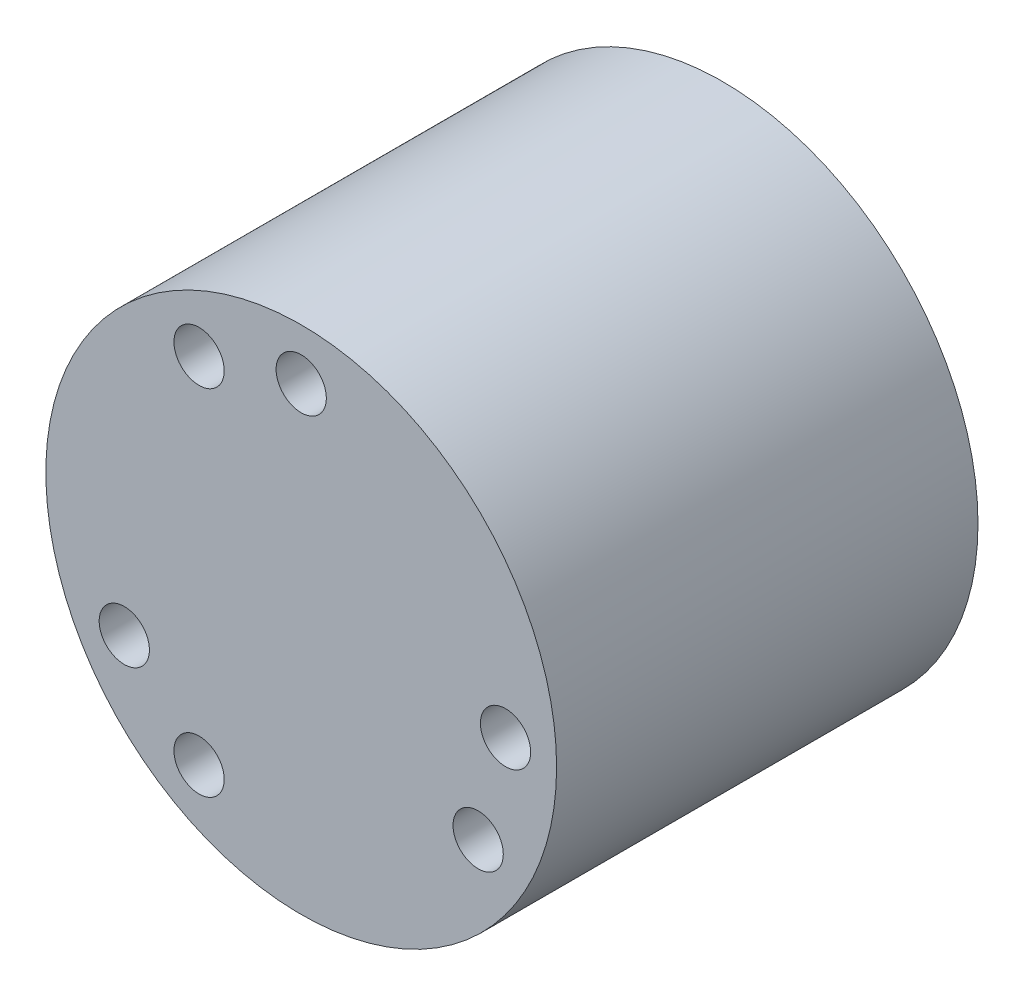
ISO-10303-21;
HEADER;
FILE_DESCRIPTION(('STEP AP214'),'2;1');
FILE_NAME('part.step','',(''),(''),'','','');
FILE_SCHEMA(('AUTOMOTIVE_DESIGN { 1 0 10303 214 1 1 1 1 }'));
ENDSEC;
DATA;
#1=APPLICATION_CONTEXT('core data for automotive mechanical design processes');
#2=APPLICATION_PROTOCOL_DEFINITION('international standard','automotive_design',2000,#1);
#3=PRODUCT_CONTEXT('',#1,'mechanical');
#4=PRODUCT('Part','Part','',(#3));
#5=PRODUCT_RELATED_PRODUCT_CATEGORY('part','',(#4));
#6=PRODUCT_DEFINITION_FORMATION('','',#4);
#7=PRODUCT_DEFINITION_CONTEXT('part definition',#1,'design');
#8=PRODUCT_DEFINITION('design','',#6,#7);
#9=PRODUCT_DEFINITION_SHAPE('','',#8);
#10=(LENGTH_UNIT() NAMED_UNIT(*) SI_UNIT(.MILLI.,.METRE.));
#11=(NAMED_UNIT(*) PLANE_ANGLE_UNIT() SI_UNIT($,.RADIAN.));
#12=(NAMED_UNIT(*) SI_UNIT($,.STERADIAN.) SOLID_ANGLE_UNIT());
#13=UNCERTAINTY_MEASURE_WITH_UNIT(LENGTH_MEASURE(1.E-05),#10,'distance_accuracy_value','');
#14=(GEOMETRIC_REPRESENTATION_CONTEXT(3) GLOBAL_UNCERTAINTY_ASSIGNED_CONTEXT((#13)) GLOBAL_UNIT_ASSIGNED_CONTEXT((#10,
#11,#12)) REPRESENTATION_CONTEXT('',''));
#15=CARTESIAN_POINT('',(0.,0.,0.));
#16=DIRECTION('',(0.,0.,1.));
#17=DIRECTION('',(1.,0.,0.));
#18=AXIS2_PLACEMENT_3D('',#15,#16,#17);
#19=CARTESIAN_POINT('',(0.,0.,20.955));
#20=DIRECTION('',(0.,0.,-1.));
#21=DIRECTION('',(-1.,0.,0.));
#22=AXIS2_PLACEMENT_3D('',#19,#20,#21);
#23=CYLINDRICAL_SURFACE('',#22,12.7);
#24=CARTESIAN_POINT('',(0.,0.,20.955));
#25=DIRECTION('',(0.,0.,1.));
#26=DIRECTION('',(1.,0.,0.));
#27=AXIS2_PLACEMENT_3D('',#24,#25,#26);
#28=CIRCLE('',#27,12.7);
#29=CARTESIAN_POINT('',(12.7,0.,20.955));
#30=VERTEX_POINT('',#29);
#31=EDGE_CURVE('E10',#30,#30,#28,.T.);
#32=ORIENTED_EDGE('',*,*,#31,.F.);
#33=EDGE_LOOP('',(#32));
#34=FACE_BOUND('',#33,.T.);
#35=CARTESIAN_POINT('',(0.,0.,0.));
#36=DIRECTION('',(0.,0.,1.));
#37=DIRECTION('',(1.,0.,0.));
#38=AXIS2_PLACEMENT_3D('',#35,#36,#37);
#39=CIRCLE('',#38,12.7);
#40=CARTESIAN_POINT('',(12.7,0.,0.));
#41=VERTEX_POINT('',#40);
#42=EDGE_CURVE('E34',#41,#41,#39,.T.);
#43=ORIENTED_EDGE('',*,*,#42,.T.);
#44=EDGE_LOOP('',(#43));
#45=FACE_BOUND('',#44,.T.);
#46=ADVANCED_FACE('F31',(#34,#45),#23,.T.);
#47=CARTESIAN_POINT('',(0.,0.,20.955));
#48=DIRECTION('',(0.,0.,1.));
#49=DIRECTION('',(1.,0.,0.));
#50=AXIS2_PLACEMENT_3D('',#47,#48,#49);
#51=PLANE('',#50);
#52=CARTESIAN_POINT('',(-5.07999999999995,-8.79881810244993,20.955));
#53=DIRECTION('',(0.,0.,1.));
#54=DIRECTION('',(1.,0.,0.));
#55=AXIS2_PLACEMENT_3D('',#52,#53,#54);
#56=CIRCLE('',#55,1.24968);
#57=CARTESIAN_POINT('',(-3.83031999999995,-8.79881810244993,20.955));
#58=VERTEX_POINT('',#57);
#59=EDGE_CURVE('E66',#58,#58,#56,.T.);
#60=ORIENTED_EDGE('',*,*,#59,.F.);
#61=EDGE_LOOP('',(#60));
#62=FACE_BOUND('',#61,.T.);
#63=CARTESIAN_POINT('',(10.16,1.06594733040311E-13,20.955));
#64=DIRECTION('',(0.,0.,1.));
#65=DIRECTION('',(1.,0.,0.));
#66=AXIS2_PLACEMENT_3D('',#63,#64,#65);
#67=CIRCLE('',#66,1.24968);
#68=CARTESIAN_POINT('',(11.40968,1.06594733040311E-13,20.955));
#69=VERTEX_POINT('',#68);
#70=EDGE_CURVE('E69',#69,#69,#67,.T.);
#71=ORIENTED_EDGE('',*,*,#70,.F.);
#72=EDGE_LOOP('',(#71));
#73=FACE_BOUND('',#72,.T.);
#74=CARTESIAN_POINT('',(-5.08000000000001,8.79881810244989,20.955));
#75=DIRECTION('',(0.,0.,1.));
#76=DIRECTION('',(1.,0.,0.));
#77=AXIS2_PLACEMENT_3D('',#74,#75,#76);
#78=CIRCLE('',#77,1.24968);
#79=CARTESIAN_POINT('',(-3.83032000000001,8.79881810244989,20.955));
#80=VERTEX_POINT('',#79);
#81=EDGE_CURVE('E58',#80,#80,#78,.T.);
#82=ORIENTED_EDGE('',*,*,#81,.F.);
#83=EDGE_LOOP('',(#82));
#84=FACE_BOUND('',#83,.T.);
#85=CARTESIAN_POINT('',(-8.79881810244988,-5.08000000000004,20.955));
#86=DIRECTION('',(0.,0.,1.));
#87=DIRECTION('',(1.,0.,0.));
#88=AXIS2_PLACEMENT_3D('',#85,#86,#87);
#89=CIRCLE('',#88,1.24968);
#90=CARTESIAN_POINT('',(-7.54913810244988,-5.08000000000004,20.955));
#91=VERTEX_POINT('',#90);
#92=EDGE_CURVE('E48',#91,#91,#89,.T.);
#93=ORIENTED_EDGE('',*,*,#92,.F.);
#94=EDGE_LOOP('',(#93));
#95=FACE_BOUND('',#94,.T.);
#96=CARTESIAN_POINT('',(8.79881810244994,-5.07999999999992,20.955));
#97=DIRECTION('',(0.,0.,1.));
#98=DIRECTION('',(1.,0.,0.));
#99=AXIS2_PLACEMENT_3D('',#96,#97,#98);
#100=CIRCLE('',#99,1.24968);
#101=CARTESIAN_POINT('',(10.0484981024499,-5.07999999999992,20.955));
#102=VERTEX_POINT('',#101);
#103=EDGE_CURVE('E51',#102,#102,#100,.T.);
#104=ORIENTED_EDGE('',*,*,#103,.F.);
#105=EDGE_LOOP('',(#104));
#106=FACE_BOUND('',#105,.T.);
#107=CARTESIAN_POINT('',(0.,10.16,20.955));
#108=DIRECTION('',(0.,0.,1.));
#109=DIRECTION('',(1.,0.,0.));
#110=AXIS2_PLACEMENT_3D('',#107,#108,#109);
#111=CIRCLE('',#110,1.24968);
#112=CARTESIAN_POINT('',(1.24968,10.16,20.955));
#113=VERTEX_POINT('',#112);
#114=EDGE_CURVE('E41',#113,#113,#111,.T.);
#115=ORIENTED_EDGE('',*,*,#114,.F.);
#116=EDGE_LOOP('',(#115));
#117=FACE_BOUND('',#116,.T.);
#118=ORIENTED_EDGE('',*,*,#31,.T.);
#119=EDGE_LOOP('',(#118));
#120=FACE_BOUND('',#119,.T.);
#121=ADVANCED_FACE('F85',(#62,#73,#84,#95,#106,#117,#120),#51,.T.);
#122=CARTESIAN_POINT('',(0.,0.,0.));
#123=DIRECTION('',(0.,0.,1.));
#124=DIRECTION('',(1.,0.,0.));
#125=AXIS2_PLACEMENT_3D('',#122,#123,#124);
#126=PLANE('',#125);
#127=CARTESIAN_POINT('',(-5.07999999999995,-8.79881810244993,0.));
#128=DIRECTION('',(0.,0.,-1.));
#129=DIRECTION('',(0.866025403784442,-0.499999999999995,0.));
#130=AXIS2_PLACEMENT_3D('',#127,#128,#129);
#131=CIRCLE('',#130,1.24968);
#132=CARTESIAN_POINT('',(-3.99774537339861,-9.42365810244992,0.));
#133=VERTEX_POINT('',#132);
#134=EDGE_CURVE('E72',#133,#133,#131,.T.);
#135=ORIENTED_EDGE('',*,*,#134,.F.);
#136=EDGE_LOOP('',(#135));
#137=FACE_BOUND('',#136,.T.);
#138=CARTESIAN_POINT('',(10.16,1.06594733040311E-13,0.));
#139=DIRECTION('',(0.,0.,-1.));
#140=DIRECTION('',(0.,1.,0.));
#141=AXIS2_PLACEMENT_3D('',#138,#139,#140);
#142=CIRCLE('',#141,1.24968);
#143=CARTESIAN_POINT('',(10.16,1.24968000000011,0.));
#144=VERTEX_POINT('',#143);
#145=EDGE_CURVE('E73',#144,#144,#142,.T.);
#146=ORIENTED_EDGE('',*,*,#145,.F.);
#147=EDGE_LOOP('',(#146));
#148=FACE_BOUND('',#147,.T.);
#149=CARTESIAN_POINT('',(-5.08000000000001,8.79881810244989,0.));
#150=DIRECTION('',(0.,0.,-1.));
#151=DIRECTION('',(-0.866025403784438,-0.500000000000001,0.));
#152=AXIS2_PLACEMENT_3D('',#149,#150,#151);
#153=CIRCLE('',#152,1.24968);
#154=CARTESIAN_POINT('',(-6.16225462660135,8.17397810244989,0.));
#155=VERTEX_POINT('',#154);
#156=EDGE_CURVE('E63',#155,#155,#153,.T.);
#157=ORIENTED_EDGE('',*,*,#156,.F.);
#158=EDGE_LOOP('',(#157));
#159=FACE_BOUND('',#158,.T.);
#160=CARTESIAN_POINT('',(-8.79881810244988,-5.08000000000004,0.));
#161=DIRECTION('',(0.,0.,-1.));
#162=DIRECTION('',(0.500000000000004,-0.866025403784436,0.));
#163=AXIS2_PLACEMENT_3D('',#160,#161,#162);
#164=CIRCLE('',#163,1.24968);
#165=CARTESIAN_POINT('',(-8.17397810244987,-6.16225462660138,0.));
#166=VERTEX_POINT('',#165);
#167=EDGE_CURVE('E54',#166,#166,#164,.T.);
#168=ORIENTED_EDGE('',*,*,#167,.F.);
#169=EDGE_LOOP('',(#168));
#170=FACE_BOUND('',#169,.T.);
#171=CARTESIAN_POINT('',(8.79881810244994,-5.07999999999992,0.));
#172=DIRECTION('',(0.,0.,-1.));
#173=DIRECTION('',(0.499999999999992,0.866025403784443,0.));
#174=AXIS2_PLACEMENT_3D('',#171,#172,#173);
#175=CIRCLE('',#174,1.24968);
#176=CARTESIAN_POINT('',(9.42365810244993,-3.99774537339858,0.));
#177=VERTEX_POINT('',#176);
#178=EDGE_CURVE('E55',#177,#177,#175,.T.);
#179=ORIENTED_EDGE('',*,*,#178,.F.);
#180=EDGE_LOOP('',(#179));
#181=FACE_BOUND('',#180,.T.);
#182=CARTESIAN_POINT('',(0.,10.16,0.));
#183=DIRECTION('',(0.,0.,-1.));
#184=DIRECTION('',(-1.,0.,0.));
#185=AXIS2_PLACEMENT_3D('',#182,#183,#184);
#186=CIRCLE('',#185,1.24968);
#187=CARTESIAN_POINT('',(-1.24968,10.16,0.));
#188=VERTEX_POINT('',#187);
#189=EDGE_CURVE('E45',#188,#188,#186,.T.);
#190=ORIENTED_EDGE('',*,*,#189,.F.);
#191=EDGE_LOOP('',(#190));
#192=FACE_BOUND('',#191,.T.);
#193=ORIENTED_EDGE('',*,*,#42,.F.);
#194=EDGE_LOOP('',(#193));
#195=FACE_BOUND('',#194,.T.);
#196=ADVANCED_FACE('F81',(#137,#148,#159,#170,#181,#192,#195),#126,.F.);
#197=CARTESIAN_POINT('',(0.,10.16,25.4));
#198=DIRECTION('',(0.,0.,-1.));
#199=DIRECTION('',(-1.,0.,0.));
#200=AXIS2_PLACEMENT_3D('',#197,#198,#199);
#201=CYLINDRICAL_SURFACE('',#200,1.24968);
#202=ORIENTED_EDGE('',*,*,#114,.T.);
#203=EDGE_LOOP('',(#202));
#204=FACE_BOUND('',#203,.T.);
#205=ORIENTED_EDGE('',*,*,#189,.T.);
#206=EDGE_LOOP('',(#205));
#207=FACE_BOUND('',#206,.T.);
#208=ADVANCED_FACE('F84',(#204,#207),#201,.F.);
#209=CARTESIAN_POINT('',(8.79881810244994,-5.07999999999992,25.4));
#210=DIRECTION('',(0.,0.,-1.));
#211=DIRECTION('',(-1.,0.,0.));
#212=AXIS2_PLACEMENT_3D('',#209,#210,#211);
#213=CYLINDRICAL_SURFACE('',#212,1.24968);
#214=ORIENTED_EDGE('',*,*,#103,.T.);
#215=EDGE_LOOP('',(#214));
#216=FACE_BOUND('',#215,.T.);
#217=ORIENTED_EDGE('',*,*,#178,.T.);
#218=EDGE_LOOP('',(#217));
#219=FACE_BOUND('',#218,.T.);
#220=ADVANCED_FACE('F113',(#216,#219),#213,.F.);
#221=CARTESIAN_POINT('',(-8.79881810244988,-5.08000000000004,25.4));
#222=DIRECTION('',(0.,0.,-1.));
#223=DIRECTION('',(-1.,0.,0.));
#224=AXIS2_PLACEMENT_3D('',#221,#222,#223);
#225=CYLINDRICAL_SURFACE('',#224,1.24968);
#226=ORIENTED_EDGE('',*,*,#92,.T.);
#227=EDGE_LOOP('',(#226));
#228=FACE_BOUND('',#227,.T.);
#229=ORIENTED_EDGE('',*,*,#167,.T.);
#230=EDGE_LOOP('',(#229));
#231=FACE_BOUND('',#230,.T.);
#232=ADVANCED_FACE('F117',(#228,#231),#225,.F.);
#233=CARTESIAN_POINT('',(-5.08000000000001,8.79881810244989,25.4));
#234=DIRECTION('',(0.,0.,-1.));
#235=DIRECTION('',(-1.,0.,0.));
#236=AXIS2_PLACEMENT_3D('',#233,#234,#235);
#237=CYLINDRICAL_SURFACE('',#236,1.24968);
#238=ORIENTED_EDGE('',*,*,#81,.T.);
#239=EDGE_LOOP('',(#238));
#240=FACE_BOUND('',#239,.T.);
#241=ORIENTED_EDGE('',*,*,#156,.T.);
#242=EDGE_LOOP('',(#241));
#243=FACE_BOUND('',#242,.T.);
#244=ADVANCED_FACE('F121',(#240,#243),#237,.F.);
#245=CARTESIAN_POINT('',(10.16,1.06594733040311E-13,25.4));
#246=DIRECTION('',(0.,0.,-1.));
#247=DIRECTION('',(-1.,0.,0.));
#248=AXIS2_PLACEMENT_3D('',#245,#246,#247);
#249=CYLINDRICAL_SURFACE('',#248,1.24968);
#250=ORIENTED_EDGE('',*,*,#70,.T.);
#251=EDGE_LOOP('',(#250));
#252=FACE_BOUND('',#251,.T.);
#253=ORIENTED_EDGE('',*,*,#145,.T.);
#254=EDGE_LOOP('',(#253));
#255=FACE_BOUND('',#254,.T.);
#256=ADVANCED_FACE('F125',(#252,#255),#249,.F.);
#257=CARTESIAN_POINT('',(-5.07999999999995,-8.79881810244993,25.4));
#258=DIRECTION('',(0.,0.,-1.));
#259=DIRECTION('',(-1.,0.,0.));
#260=AXIS2_PLACEMENT_3D('',#257,#258,#259);
#261=CYLINDRICAL_SURFACE('',#260,1.24968);
#262=ORIENTED_EDGE('',*,*,#59,.T.);
#263=EDGE_LOOP('',(#262));
#264=FACE_BOUND('',#263,.T.);
#265=ORIENTED_EDGE('',*,*,#134,.T.);
#266=EDGE_LOOP('',(#265));
#267=FACE_BOUND('',#266,.T.);
#268=ADVANCED_FACE('F79',(#264,#267),#261,.F.);
#269=CLOSED_SHELL('',(#46,#121,#196,#208,#220,#232,#244,#256,#268));
#270=MANIFOLD_SOLID_BREP('B2',#269);
#271=ADVANCED_BREP_SHAPE_REPRESENTATION('',(#18,#270),#14);
#272=SHAPE_DEFINITION_REPRESENTATION(#9,#271);
ENDSEC;
END-ISO-10303-21;
